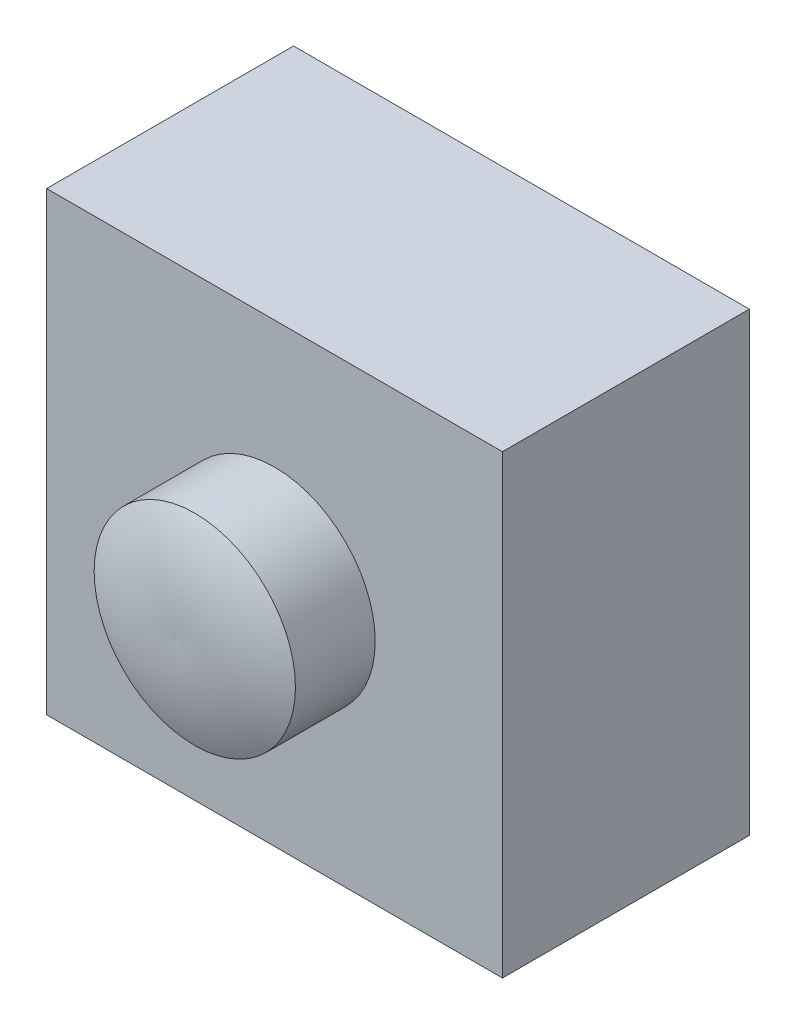
ISO-10303-21;
HEADER;
FILE_DESCRIPTION(('STEP AP214'),'2;1');
FILE_NAME('part.step','',(''),(''),'','','');
FILE_SCHEMA(('AUTOMOTIVE_DESIGN { 1 0 10303 214 1 1 1 1 }'));
ENDSEC;
DATA;
#1=APPLICATION_CONTEXT('core data for automotive mechanical design processes');
#2=APPLICATION_PROTOCOL_DEFINITION('international standard','automotive_design',2000,#1);
#3=PRODUCT_CONTEXT('',#1,'mechanical');
#4=PRODUCT('Part','Part','',(#3));
#5=PRODUCT_RELATED_PRODUCT_CATEGORY('part','',(#4));
#6=PRODUCT_DEFINITION_FORMATION('','',#4);
#7=PRODUCT_DEFINITION_CONTEXT('part definition',#1,'design');
#8=PRODUCT_DEFINITION('design','',#6,#7);
#9=PRODUCT_DEFINITION_SHAPE('','',#8);
#10=(LENGTH_UNIT() NAMED_UNIT(*) SI_UNIT(.MILLI.,.METRE.));
#11=(NAMED_UNIT(*) PLANE_ANGLE_UNIT() SI_UNIT($,.RADIAN.));
#12=(NAMED_UNIT(*) SI_UNIT($,.STERADIAN.) SOLID_ANGLE_UNIT());
#13=UNCERTAINTY_MEASURE_WITH_UNIT(LENGTH_MEASURE(1.E-05),#10,'distance_accuracy_value','');
#14=(GEOMETRIC_REPRESENTATION_CONTEXT(3) GLOBAL_UNCERTAINTY_ASSIGNED_CONTEXT((#13)) GLOBAL_UNIT_ASSIGNED_CONTEXT((#10,
#11,#12)) REPRESENTATION_CONTEXT('',''));
#15=CARTESIAN_POINT('',(0.,0.,0.));
#16=DIRECTION('',(0.,0.,1.));
#17=DIRECTION('',(1.,0.,0.));
#18=AXIS2_PLACEMENT_3D('',#15,#16,#17);
#19=CARTESIAN_POINT('',(0.,0.,6.5));
#20=DIRECTION('',(0.,1.,0.));
#21=DIRECTION('',(0.,0.,1.));
#22=AXIS2_PLACEMENT_3D('',#19,#20,#21);
#23=PLANE('',#22);
#24=DIRECTION('',(0.,0.,-1.));
#25=VECTOR('',#24,1.);
#26=CARTESIAN_POINT('',(2.55,0.,3.6));
#27=LINE('',#26,#25);
#28=CARTESIAN_POINT('',(2.55,0.,3.6));
#29=VERTEX_POINT('',#28);
#30=CARTESIAN_POINT('',(2.55,0.,3.2));
#31=VERTEX_POINT('',#30);
#32=EDGE_CURVE('E419',#29,#31,#27,.T.);
#33=ORIENTED_EDGE('',*,*,#32,.F.);
#34=DIRECTION('',(-1.,0.,0.));
#35=VECTOR('',#34,1.);
#36=CARTESIAN_POINT('',(4.15,0.,3.6));
#37=LINE('',#36,#35);
#38=CARTESIAN_POINT('',(4.15,0.,3.6));
#39=VERTEX_POINT('',#38);
#40=EDGE_CURVE('E431',#39,#29,#37,.T.);
#41=ORIENTED_EDGE('',*,*,#40,.F.);
#42=DIRECTION('',(0.,0.,1.));
#43=VECTOR('',#42,1.);
#44=CARTESIAN_POINT('',(4.15,0.,3.6));
#45=LINE('',#44,#43);
#46=CARTESIAN_POINT('',(4.15,0.,3.2));
#47=VERTEX_POINT('',#46);
#48=EDGE_CURVE('E427',#47,#39,#45,.T.);
#49=ORIENTED_EDGE('',*,*,#48,.F.);
#50=DIRECTION('',(1.,0.,0.));
#51=VECTOR('',#50,1.);
#52=CARTESIAN_POINT('',(4.15,0.,3.2));
#53=LINE('',#52,#51);
#54=EDGE_CURVE('E423',#31,#47,#53,.T.);
#55=ORIENTED_EDGE('',*,*,#54,.F.);
#56=EDGE_LOOP('',(#33,#41,#49,#55));
#57=FACE_BOUND('',#56,.T.);
#58=DIRECTION('',(1.,0.,0.));
#59=VECTOR('',#58,1.);
#60=CARTESIAN_POINT('',(0.,0.,0.));
#61=LINE('',#60,#59);
#62=CARTESIAN_POINT('',(0.,0.,0.));
#63=VERTEX_POINT('',#62);
#64=CARTESIAN_POINT('',(12.,0.,0.));
#65=VERTEX_POINT('',#64);
#66=EDGE_CURVE('E474',#63,#65,#61,.T.);
#67=ORIENTED_EDGE('',*,*,#66,.T.);
#68=DIRECTION('',(0.,0.,-1.));
#69=VECTOR('',#68,1.);
#70=CARTESIAN_POINT('',(12.,0.,6.5));
#71=LINE('',#70,#69);
#72=CARTESIAN_POINT('',(12.,0.,6.5));
#73=VERTEX_POINT('',#72);
#74=EDGE_CURVE('E489',#73,#65,#71,.T.);
#75=ORIENTED_EDGE('',*,*,#74,.F.);
#76=DIRECTION('',(1.,0.,0.));
#77=VECTOR('',#76,1.);
#78=CARTESIAN_POINT('',(0.,0.,6.5));
#79=LINE('',#78,#77);
#80=CARTESIAN_POINT('',(0.,0.,6.5));
#81=VERTEX_POINT('',#80);
#82=EDGE_CURVE('E460',#81,#73,#79,.T.);
#83=ORIENTED_EDGE('',*,*,#82,.F.);
#84=DIRECTION('',(0.,0.,-1.));
#85=VECTOR('',#84,1.);
#86=CARTESIAN_POINT('',(0.,0.,6.5));
#87=LINE('',#86,#85);
#88=EDGE_CURVE('E493',#81,#63,#87,.T.);
#89=ORIENTED_EDGE('',*,*,#88,.T.);
#90=EDGE_LOOP('',(#67,#75,#83,#89));
#91=FACE_BOUND('',#90,.T.);
#92=DIRECTION('',(0.,0.,-1.));
#93=VECTOR('',#92,1.);
#94=CARTESIAN_POINT('',(7.85,0.,3.6));
#95=LINE('',#94,#93);
#96=CARTESIAN_POINT('',(7.85,0.,3.6));
#97=VERTEX_POINT('',#96);
#98=CARTESIAN_POINT('',(7.85,0.,3.2));
#99=VERTEX_POINT('',#98);
#100=EDGE_CURVE('E391',#97,#99,#95,.T.);
#101=ORIENTED_EDGE('',*,*,#100,.F.);
#102=DIRECTION('',(-1.,0.,0.));
#103=VECTOR('',#102,1.);
#104=CARTESIAN_POINT('',(7.85,0.,3.6));
#105=LINE('',#104,#103);
#106=CARTESIAN_POINT('',(9.45,0.,3.6));
#107=VERTEX_POINT('',#106);
#108=EDGE_CURVE('E403',#107,#97,#105,.T.);
#109=ORIENTED_EDGE('',*,*,#108,.F.);
#110=DIRECTION('',(0.,0.,1.));
#111=VECTOR('',#110,1.);
#112=CARTESIAN_POINT('',(9.45,0.,3.6));
#113=LINE('',#112,#111);
#114=CARTESIAN_POINT('',(9.45,0.,3.2));
#115=VERTEX_POINT('',#114);
#116=EDGE_CURVE('E399',#115,#107,#113,.T.);
#117=ORIENTED_EDGE('',*,*,#116,.F.);
#118=DIRECTION('',(1.,0.,0.));
#119=VECTOR('',#118,1.);
#120=CARTESIAN_POINT('',(7.85,0.,3.2));
#121=LINE('',#120,#119);
#122=EDGE_CURVE('E395',#99,#115,#121,.T.);
#123=ORIENTED_EDGE('',*,*,#122,.F.);
#124=EDGE_LOOP('',(#101,#109,#117,#123));
#125=FACE_BOUND('',#124,.T.);
#126=ADVANCED_FACE('F48',(#57,#91,#125),#23,.F.);
#127=CARTESIAN_POINT('',(0.,0.,6.5));
#128=DIRECTION('',(1.,0.,0.));
#129=DIRECTION('',(0.,0.,-1.));
#130=AXIS2_PLACEMENT_3D('',#127,#128,#129);
#131=PLANE('',#130);
#132=DIRECTION('',(0.,-1.,0.));
#133=VECTOR('',#132,1.);
#134=CARTESIAN_POINT('',(0.,0.,0.));
#135=LINE('',#134,#133);
#136=CARTESIAN_POINT('',(0.,12.,0.));
#137=VERTEX_POINT('',#136);
#138=EDGE_CURVE('E455',#137,#63,#135,.T.);
#139=ORIENTED_EDGE('',*,*,#138,.T.);
#140=ORIENTED_EDGE('',*,*,#88,.F.);
#141=DIRECTION('',(0.,-1.,0.));
#142=VECTOR('',#141,1.);
#143=CARTESIAN_POINT('',(0.,0.,6.5));
#144=LINE('',#143,#142);
#145=CARTESIAN_POINT('',(0.,12.,6.5));
#146=VERTEX_POINT('',#145);
#147=EDGE_CURVE('E456',#146,#81,#144,.T.);
#148=ORIENTED_EDGE('',*,*,#147,.F.);
#149=DIRECTION('',(0.,0.,-1.));
#150=VECTOR('',#149,1.);
#151=CARTESIAN_POINT('',(0.,12.,6.5));
#152=LINE('',#151,#150);
#153=EDGE_CURVE('E470',#146,#137,#152,.T.);
#154=ORIENTED_EDGE('',*,*,#153,.T.);
#155=EDGE_LOOP('',(#139,#140,#148,#154));
#156=FACE_BOUND('',#155,.T.);
#157=ADVANCED_FACE('F678',(#156),#131,.F.);
#158=CARTESIAN_POINT('',(12.,0.,6.5));
#159=DIRECTION('',(-1.,0.,0.));
#160=DIRECTION('',(0.,0.,1.));
#161=AXIS2_PLACEMENT_3D('',#158,#159,#160);
#162=PLANE('',#161);
#163=DIRECTION('',(0.,1.,0.));
#164=VECTOR('',#163,1.);
#165=CARTESIAN_POINT('',(12.,0.,0.));
#166=LINE('',#165,#164);
#167=CARTESIAN_POINT('',(12.,12.,0.));
#168=VERTEX_POINT('',#167);
#169=EDGE_CURVE('E477',#65,#168,#166,.T.);
#170=ORIENTED_EDGE('',*,*,#169,.T.);
#171=DIRECTION('',(0.,0.,-1.));
#172=VECTOR('',#171,1.);
#173=CARTESIAN_POINT('',(12.,12.,6.5));
#174=LINE('',#173,#172);
#175=CARTESIAN_POINT('',(12.,12.,6.5));
#176=VERTEX_POINT('',#175);
#177=EDGE_CURVE('E485',#176,#168,#174,.T.);
#178=ORIENTED_EDGE('',*,*,#177,.F.);
#179=DIRECTION('',(0.,1.,0.));
#180=VECTOR('',#179,1.);
#181=CARTESIAN_POINT('',(12.,0.,6.5));
#182=LINE('',#181,#180);
#183=EDGE_CURVE('E464',#73,#176,#182,.T.);
#184=ORIENTED_EDGE('',*,*,#183,.F.);
#185=ORIENTED_EDGE('',*,*,#74,.T.);
#186=EDGE_LOOP('',(#170,#178,#184,#185));
#187=FACE_BOUND('',#186,.T.);
#188=ADVANCED_FACE('F684',(#187),#162,.F.);
#189=CARTESIAN_POINT('',(0.,12.,6.5));
#190=DIRECTION('',(0.,-1.,0.));
#191=DIRECTION('',(0.,0.,-1.));
#192=AXIS2_PLACEMENT_3D('',#189,#190,#191);
#193=PLANE('',#192);
#194=DIRECTION('',(-1.,0.,0.));
#195=VECTOR('',#194,1.);
#196=CARTESIAN_POINT('',(0.,12.,0.));
#197=LINE('',#196,#195);
#198=EDGE_CURVE('E461',#168,#137,#197,.T.);
#199=ORIENTED_EDGE('',*,*,#198,.T.);
#200=ORIENTED_EDGE('',*,*,#153,.F.);
#201=DIRECTION('',(-1.,0.,0.));
#202=VECTOR('',#201,1.);
#203=CARTESIAN_POINT('',(0.,12.,6.5));
#204=LINE('',#203,#202);
#205=EDGE_CURVE('E467',#176,#146,#204,.T.);
#206=ORIENTED_EDGE('',*,*,#205,.F.);
#207=ORIENTED_EDGE('',*,*,#177,.T.);
#208=EDGE_LOOP('',(#199,#200,#206,#207));
#209=FACE_BOUND('',#208,.T.);
#210=ADVANCED_FACE('F757',(#209),#193,.F.);
#211=CARTESIAN_POINT('',(0.,0.,6.5));
#212=DIRECTION('',(0.,0.,-1.));
#213=DIRECTION('',(-1.,0.,0.));
#214=AXIS2_PLACEMENT_3D('',#211,#212,#213);
#215=PLANE('',#214);
#216=CARTESIAN_POINT('',(6.,6.,6.5));
#217=DIRECTION('',(0.,0.,-1.));
#218=DIRECTION('',(-1.,0.,0.));
#219=AXIS2_PLACEMENT_3D('',#216,#217,#218);
#220=CIRCLE('',#219,2.65);
#221=CARTESIAN_POINT('',(3.35,6.,6.5));
#222=VERTEX_POINT('',#221);
#223=EDGE_CURVE('E451',#222,#222,#220,.T.);
#224=ORIENTED_EDGE('',*,*,#223,.T.);
#225=EDGE_LOOP('',(#224));
#226=FACE_BOUND('',#225,.T.);
#227=ORIENTED_EDGE('',*,*,#147,.T.);
#228=ORIENTED_EDGE('',*,*,#82,.T.);
#229=ORIENTED_EDGE('',*,*,#183,.T.);
#230=ORIENTED_EDGE('',*,*,#205,.T.);
#231=EDGE_LOOP('',(#227,#228,#229,#230));
#232=FACE_BOUND('',#231,.T.);
#233=ADVANCED_FACE('F754',(#226,#232),#215,.F.);
#234=CARTESIAN_POINT('',(0.,0.,0.));
#235=DIRECTION('',(0.,0.,-1.));
#236=DIRECTION('',(-1.,0.,0.));
#237=AXIS2_PLACEMENT_3D('',#234,#235,#236);
#238=PLANE('',#237);
#239=ORIENTED_EDGE('',*,*,#138,.F.);
#240=ORIENTED_EDGE('',*,*,#198,.F.);
#241=ORIENTED_EDGE('',*,*,#169,.F.);
#242=ORIENTED_EDGE('',*,*,#66,.F.);
#243=EDGE_LOOP('',(#239,#240,#241,#242));
#244=FACE_BOUND('',#243,.T.);
#245=ADVANCED_FACE('F752',(#244),#238,.T.);
#246=CARTESIAN_POINT('',(6.,6.,6.5));
#247=DIRECTION('',(0.,0.,-1.));
#248=DIRECTION('',(-1.,0.,0.));
#249=AXIS2_PLACEMENT_3D('',#246,#247,#248);
#250=CYLINDRICAL_SURFACE('',#249,2.65);
#251=CARTESIAN_POINT('',(6.,6.,8.6));
#252=DIRECTION('',(0.,0.,-1.));
#253=DIRECTION('',(-1.,0.,0.));
#254=AXIS2_PLACEMENT_3D('',#251,#252,#253);
#255=CIRCLE('',#254,2.65);
#256=CARTESIAN_POINT('',(3.35,6.,8.6));
#257=VERTEX_POINT('',#256);
#258=EDGE_CURVE('E447',#257,#257,#255,.T.);
#259=ORIENTED_EDGE('',*,*,#258,.T.);
#260=EDGE_LOOP('',(#259));
#261=FACE_BOUND('',#260,.T.);
#262=ORIENTED_EDGE('',*,*,#223,.F.);
#263=EDGE_LOOP('',(#262));
#264=FACE_BOUND('',#263,.T.);
#265=ADVANCED_FACE('F748',(#261,#264),#250,.T.);
#266=CARTESIAN_POINT('',(5.66335814684424,6.,3.61170182172552));
#267=DIRECTION('',(0.,-1.,0.));
#268=DIRECTION('',(-1.,0.,0.));
#269=AXIS2_PLACEMENT_3D('',#266,#267,#268);
#270=CIRCLE('',#269,5.49861297337312);
#271=TRIMMED_CURVE('',#270,(PARAMETER_VALUE(-1.63205768742065)),
(PARAMETER_VALUE(1.63205768742065)),.T.,.PARAMETER.);
#272=CARTESIAN_POINT('',(6.,6.,3.61170182172552));
#273=DIRECTION('',(0.,0.,-1.));
#274=AXIS1_PLACEMENT('',#272,#273);
#275=SURFACE_OF_REVOLUTION('',#271,#274);
#276=CARTESIAN_POINT('',(6.,6.,9.1));
#277=VERTEX_POINT('',#276);
#278=VERTEX_LOOP('',#277);
#279=FACE_BOUND('',#278,.T.);
#280=ORIENTED_EDGE('',*,*,#258,.F.);
#281=EDGE_LOOP('',(#280));
#282=FACE_BOUND('',#281,.T.);
#283=ADVANCED_FACE('F742',(#279,#282),#275,.T.);
#284=CARTESIAN_POINT('',(2.55,-0.5,3.6));
#285=DIRECTION('',(1.,0.,0.));
#286=DIRECTION('',(0.,0.,-1.));
#287=AXIS2_PLACEMENT_3D('',#284,#285,#286);
#288=PLANE('',#287);
#289=DIRECTION('',(0.,0.,1.));
#290=VECTOR('',#289,1.);
#291=CARTESIAN_POINT('',(2.55,-0.9,0.));
#292=LINE('',#291,#290);
#293=CARTESIAN_POINT('',(2.55,-0.9,0.4));
#294=VERTEX_POINT('',#293);
#295=CARTESIAN_POINT('',(2.55,-0.9,3.));
#296=VERTEX_POINT('',#295);
#297=EDGE_CURVE('E340',#294,#296,#292,.T.);
#298=ORIENTED_EDGE('',*,*,#297,.T.);
#299=CARTESIAN_POINT('',(2.55,-0.3,3.));
#300=DIRECTION('',(1.,0.,0.));
#301=DIRECTION('',(0.,0.,-1.));
#302=AXIS2_PLACEMENT_3D('',#299,#300,#301);
#303=CIRCLE('',#302,0.6);
#304=CARTESIAN_POINT('',(2.55,-0.3,3.6));
#305=VERTEX_POINT('',#304);
#306=EDGE_CURVE('E514',#296,#305,#303,.F.);
#307=ORIENTED_EDGE('',*,*,#306,.T.);
#308=DIRECTION('',(0.,1.,0.));
#309=VECTOR('',#308,1.);
#310=CARTESIAN_POINT('',(2.55,-0.5,3.6));
#311=LINE('',#310,#309);
#312=EDGE_CURVE('E435',#305,#29,#311,.T.);
#313=ORIENTED_EDGE('',*,*,#312,.T.);
#314=ORIENTED_EDGE('',*,*,#32,.T.);
#315=DIRECTION('',(0.,1.,0.));
#316=VECTOR('',#315,1.);
#317=CARTESIAN_POINT('',(2.55,-0.5,3.2));
#318=LINE('',#317,#316);
#319=CARTESIAN_POINT('',(2.55,-0.2,3.2));
#320=VERTEX_POINT('',#319);
#321=EDGE_CURVE('E444',#320,#31,#318,.T.);
#322=ORIENTED_EDGE('',*,*,#321,.F.);
#323=CARTESIAN_POINT('',(2.55,-0.2,2.9));
#324=DIRECTION('',(1.,0.,0.));
#325=DIRECTION('',(0.,0.,-1.));
#326=AXIS2_PLACEMENT_3D('',#323,#324,#325);
#327=CIRCLE('',#326,0.3);
#328=CARTESIAN_POINT('',(2.55,-0.5,2.9));
#329=VERTEX_POINT('',#328);
#330=EDGE_CURVE('E11',#320,#329,#327,.T.);
#331=ORIENTED_EDGE('',*,*,#330,.T.);
#332=DIRECTION('',(0.,0.,1.));
#333=VECTOR('',#332,1.);
#334=CARTESIAN_POINT('',(2.55,-0.5,0.));
#335=LINE('',#334,#333);
#336=CARTESIAN_POINT('',(2.55,-0.5,0.4));
#337=VERTEX_POINT('',#336);
#338=EDGE_CURVE('E364',#337,#329,#335,.T.);
#339=ORIENTED_EDGE('',*,*,#338,.F.);
#340=DIRECTION('',(0.,1.,0.));
#341=VECTOR('',#340,1.);
#342=CARTESIAN_POINT('',(2.55,-0.9,0.4));
#343=LINE('',#342,#341);
#344=EDGE_CURVE('E373',#294,#337,#343,.T.);
#345=ORIENTED_EDGE('',*,*,#344,.F.);
#346=EDGE_LOOP('',(#298,#307,#313,#314,#322,#331,#339,#345));
#347=FACE_BOUND('',#346,.T.);
#348=ADVANCED_FACE('F708',(#347),#288,.F.);
#349=CARTESIAN_POINT('',(4.15,-0.5,3.2));
#350=DIRECTION('',(0.,0.,1.));
#351=DIRECTION('',(1.,0.,0.));
#352=AXIS2_PLACEMENT_3D('',#349,#350,#351);
#353=PLANE('',#352);
#354=DIRECTION('',(0.,1.,0.));
#355=VECTOR('',#354,1.);
#356=CARTESIAN_POINT('',(4.15,-0.5,3.2));
#357=LINE('',#356,#355);
#358=CARTESIAN_POINT('',(4.15,-0.2,3.2));
#359=VERTEX_POINT('',#358);
#360=EDGE_CURVE('E441',#359,#47,#357,.T.);
#361=ORIENTED_EDGE('',*,*,#360,.F.);
#362=DIRECTION('',(1.,0.,0.));
#363=VECTOR('',#362,1.);
#364=CARTESIAN_POINT('',(2.55,-0.2,3.2));
#365=LINE('',#364,#363);
#366=EDGE_CURVE('E64',#359,#320,#365,.F.);
#367=ORIENTED_EDGE('',*,*,#366,.T.);
#368=ORIENTED_EDGE('',*,*,#321,.T.);
#369=ORIENTED_EDGE('',*,*,#54,.T.);
#370=EDGE_LOOP('',(#361,#367,#368,#369));
#371=FACE_BOUND('',#370,.T.);
#372=ADVANCED_FACE('F734',(#371),#353,.F.);
#373=CARTESIAN_POINT('',(4.15,-0.5,3.6));
#374=DIRECTION('',(-1.,0.,0.));
#375=DIRECTION('',(0.,0.,1.));
#376=AXIS2_PLACEMENT_3D('',#373,#374,#375);
#377=PLANE('',#376);
#378=DIRECTION('',(0.,1.,0.));
#379=VECTOR('',#378,1.);
#380=CARTESIAN_POINT('',(4.15,-0.5,3.6));
#381=LINE('',#380,#379);
#382=CARTESIAN_POINT('',(4.15,-0.3,3.6));
#383=VERTEX_POINT('',#382);
#384=EDGE_CURVE('E438',#383,#39,#381,.T.);
#385=ORIENTED_EDGE('',*,*,#384,.F.);
#386=CARTESIAN_POINT('',(4.15,-0.3,3.));
#387=DIRECTION('',(-1.,0.,0.));
#388=DIRECTION('',(0.,0.,1.));
#389=AXIS2_PLACEMENT_3D('',#386,#387,#388);
#390=CIRCLE('',#389,0.6);
#391=CARTESIAN_POINT('',(4.15,-0.9,3.));
#392=VERTEX_POINT('',#391);
#393=EDGE_CURVE('E520',#383,#392,#390,.F.);
#394=ORIENTED_EDGE('',*,*,#393,.T.);
#395=DIRECTION('',(0.,0.,1.));
#396=VECTOR('',#395,1.);
#397=CARTESIAN_POINT('',(4.15,-0.9,0.));
#398=LINE('',#397,#396);
#399=CARTESIAN_POINT('',(4.15,-0.9,0.4));
#400=VERTEX_POINT('',#399);
#401=EDGE_CURVE('E336',#400,#392,#398,.T.);
#402=ORIENTED_EDGE('',*,*,#401,.F.);
#403=DIRECTION('',(0.,1.,0.));
#404=VECTOR('',#403,1.);
#405=CARTESIAN_POINT('',(4.15,-0.9,0.4));
#406=LINE('',#405,#404);
#407=CARTESIAN_POINT('',(4.15,-0.5,0.4));
#408=VERTEX_POINT('',#407);
#409=EDGE_CURVE('E376',#400,#408,#406,.T.);
#410=ORIENTED_EDGE('',*,*,#409,.T.);
#411=DIRECTION('',(0.,0.,1.));
#412=VECTOR('',#411,1.);
#413=CARTESIAN_POINT('',(4.15,-0.5,0.));
#414=LINE('',#413,#412);
#415=CARTESIAN_POINT('',(4.15,-0.5,2.9));
#416=VERTEX_POINT('',#415);
#417=EDGE_CURVE('E361',#408,#416,#414,.T.);
#418=ORIENTED_EDGE('',*,*,#417,.T.);
#419=CARTESIAN_POINT('',(4.15,-0.2,2.9));
#420=DIRECTION('',(-1.,0.,0.));
#421=DIRECTION('',(0.,0.,1.));
#422=AXIS2_PLACEMENT_3D('',#419,#420,#421);
#423=CIRCLE('',#422,0.3);
#424=EDGE_CURVE('E57',#416,#359,#423,.T.);
#425=ORIENTED_EDGE('',*,*,#424,.T.);
#426=ORIENTED_EDGE('',*,*,#360,.T.);
#427=ORIENTED_EDGE('',*,*,#48,.T.);
#428=EDGE_LOOP('',(#385,#394,#402,#410,#418,#425,#426,#427));
#429=FACE_BOUND('',#428,.T.);
#430=ADVANCED_FACE('F733',(#429),#377,.F.);
#431=CARTESIAN_POINT('',(4.15,-0.5,3.6));
#432=DIRECTION('',(0.,0.,-1.));
#433=DIRECTION('',(-1.,0.,0.));
#434=AXIS2_PLACEMENT_3D('',#431,#432,#433);
#435=PLANE('',#434);
#436=ORIENTED_EDGE('',*,*,#312,.F.);
#437=DIRECTION('',(-1.,0.,0.));
#438=VECTOR('',#437,1.);
#439=CARTESIAN_POINT('',(4.15,-0.3,3.6));
#440=LINE('',#439,#438);
#441=EDGE_CURVE('E517',#305,#383,#440,.F.);
#442=ORIENTED_EDGE('',*,*,#441,.T.);
#443=ORIENTED_EDGE('',*,*,#384,.T.);
#444=ORIENTED_EDGE('',*,*,#40,.T.);
#445=EDGE_LOOP('',(#436,#442,#443,#444));
#446=FACE_BOUND('',#445,.T.);
#447=ADVANCED_FACE('F728',(#446),#435,.F.);
#448=CARTESIAN_POINT('',(7.85,-0.5,3.6));
#449=DIRECTION('',(1.,0.,0.));
#450=DIRECTION('',(0.,0.,-1.));
#451=AXIS2_PLACEMENT_3D('',#448,#449,#450);
#452=PLANE('',#451);
#453=DIRECTION('',(0.,0.,1.));
#454=VECTOR('',#453,1.);
#455=CARTESIAN_POINT('',(7.85,-0.9,0.));
#456=LINE('',#455,#454);
#457=CARTESIAN_POINT('',(7.85,-0.9,0.4));
#458=VERTEX_POINT('',#457);
#459=CARTESIAN_POINT('',(7.85,-0.9,3.));
#460=VERTEX_POINT('',#459);
#461=EDGE_CURVE('E279',#458,#460,#456,.T.);
#462=ORIENTED_EDGE('',*,*,#461,.T.);
#463=CARTESIAN_POINT('',(7.85,-0.3,3.));
#464=DIRECTION('',(1.,0.,0.));
#465=DIRECTION('',(0.,0.,-1.));
#466=AXIS2_PLACEMENT_3D('',#463,#464,#465);
#467=CIRCLE('',#466,0.6);
#468=CARTESIAN_POINT('',(7.85,-0.3,3.6));
#469=VERTEX_POINT('',#468);
#470=EDGE_CURVE('E501',#460,#469,#467,.F.);
#471=ORIENTED_EDGE('',*,*,#470,.T.);
#472=DIRECTION('',(0.,1.,0.));
#473=VECTOR('',#472,1.);
#474=CARTESIAN_POINT('',(7.85,-0.5,3.6));
#475=LINE('',#474,#473);
#476=EDGE_CURVE('E407',#469,#97,#475,.T.);
#477=ORIENTED_EDGE('',*,*,#476,.T.);
#478=ORIENTED_EDGE('',*,*,#100,.T.);
#479=DIRECTION('',(0.,1.,0.));
#480=VECTOR('',#479,1.);
#481=CARTESIAN_POINT('',(7.85,-0.5,3.2));
#482=LINE('',#481,#480);
#483=CARTESIAN_POINT('',(7.85,-0.2,3.2));
#484=VERTEX_POINT('',#483);
#485=EDGE_CURVE('E416',#484,#99,#482,.T.);
#486=ORIENTED_EDGE('',*,*,#485,.F.);
#487=CARTESIAN_POINT('',(7.85,-0.2,2.9));
#488=DIRECTION('',(1.,0.,0.));
#489=DIRECTION('',(0.,0.,-1.));
#490=AXIS2_PLACEMENT_3D('',#487,#488,#489);
#491=CIRCLE('',#490,0.3);
#492=CARTESIAN_POINT('',(7.85,-0.5,2.9));
#493=VERTEX_POINT('',#492);
#494=EDGE_CURVE('E539',#484,#493,#491,.T.);
#495=ORIENTED_EDGE('',*,*,#494,.T.);
#496=DIRECTION('',(0.,0.,1.));
#497=VECTOR('',#496,1.);
#498=CARTESIAN_POINT('',(7.85,-0.5,0.));
#499=LINE('',#498,#497);
#500=CARTESIAN_POINT('',(7.85,-0.5,0.4));
#501=VERTEX_POINT('',#500);
#502=EDGE_CURVE('E301',#501,#493,#499,.T.);
#503=ORIENTED_EDGE('',*,*,#502,.F.);
#504=DIRECTION('',(0.,1.,0.));
#505=VECTOR('',#504,1.);
#506=CARTESIAN_POINT('',(7.85,-0.9,0.4));
#507=LINE('',#506,#505);
#508=EDGE_CURVE('E313',#458,#501,#507,.T.);
#509=ORIENTED_EDGE('',*,*,#508,.F.);
#510=EDGE_LOOP('',(#462,#471,#477,#478,#486,#495,#503,#509));
#511=FACE_BOUND('',#510,.T.);
#512=ADVANCED_FACE('F630',(#511),#452,.F.);
#513=CARTESIAN_POINT('',(7.85,-0.5,3.2));
#514=DIRECTION('',(0.,0.,1.));
#515=DIRECTION('',(1.,0.,0.));
#516=AXIS2_PLACEMENT_3D('',#513,#514,#515);
#517=PLANE('',#516);
#518=DIRECTION('',(0.,1.,0.));
#519=VECTOR('',#518,1.);
#520=CARTESIAN_POINT('',(9.45,-0.5,3.2));
#521=LINE('',#520,#519);
#522=CARTESIAN_POINT('',(9.45,-0.2,3.2));
#523=VERTEX_POINT('',#522);
#524=EDGE_CURVE('E413',#523,#115,#521,.T.);
#525=ORIENTED_EDGE('',*,*,#524,.F.);
#526=DIRECTION('',(1.,0.,0.));
#527=VECTOR('',#526,1.);
#528=CARTESIAN_POINT('',(7.85,-0.2,3.2));
#529=LINE('',#528,#527);
#530=EDGE_CURVE('E527',#523,#484,#529,.F.);
#531=ORIENTED_EDGE('',*,*,#530,.T.);
#532=ORIENTED_EDGE('',*,*,#485,.T.);
#533=ORIENTED_EDGE('',*,*,#122,.T.);
#534=EDGE_LOOP('',(#525,#531,#532,#533));
#535=FACE_BOUND('',#534,.T.);
#536=ADVANCED_FACE('F645',(#535),#517,.F.);
#537=CARTESIAN_POINT('',(9.45,-0.5,3.6));
#538=DIRECTION('',(-1.,0.,0.));
#539=DIRECTION('',(0.,0.,1.));
#540=AXIS2_PLACEMENT_3D('',#537,#538,#539);
#541=PLANE('',#540);
#542=DIRECTION('',(0.,1.,0.));
#543=VECTOR('',#542,1.);
#544=CARTESIAN_POINT('',(9.45,-0.5,3.6));
#545=LINE('',#544,#543);
#546=CARTESIAN_POINT('',(9.45,-0.3,3.6));
#547=VERTEX_POINT('',#546);
#548=EDGE_CURVE('E410',#547,#107,#545,.T.);
#549=ORIENTED_EDGE('',*,*,#548,.F.);
#550=CARTESIAN_POINT('',(9.45,-0.3,3.));
#551=DIRECTION('',(-1.,0.,0.));
#552=DIRECTION('',(0.,0.,1.));
#553=AXIS2_PLACEMENT_3D('',#550,#551,#552);
#554=CIRCLE('',#553,0.6);
#555=CARTESIAN_POINT('',(9.45,-0.9,3.));
#556=VERTEX_POINT('',#555);
#557=EDGE_CURVE('E507',#547,#556,#554,.F.);
#558=ORIENTED_EDGE('',*,*,#557,.T.);
#559=DIRECTION('',(0.,0.,1.));
#560=VECTOR('',#559,1.);
#561=CARTESIAN_POINT('',(9.45,-0.9,0.));
#562=LINE('',#561,#560);
#563=CARTESIAN_POINT('',(9.45,-0.9,0.4));
#564=VERTEX_POINT('',#563);
#565=EDGE_CURVE('E276',#564,#556,#562,.T.);
#566=ORIENTED_EDGE('',*,*,#565,.F.);
#567=DIRECTION('',(0.,1.,0.));
#568=VECTOR('',#567,1.);
#569=CARTESIAN_POINT('',(9.45,-0.9,0.4));
#570=LINE('',#569,#568);
#571=CARTESIAN_POINT('',(9.45,-0.5,0.4));
#572=VERTEX_POINT('',#571);
#573=EDGE_CURVE('E316',#564,#572,#570,.T.);
#574=ORIENTED_EDGE('',*,*,#573,.T.);
#575=DIRECTION('',(0.,0.,1.));
#576=VECTOR('',#575,1.);
#577=CARTESIAN_POINT('',(9.45,-0.5,0.));
#578=LINE('',#577,#576);
#579=CARTESIAN_POINT('',(9.45,-0.5,2.9));
#580=VERTEX_POINT('',#579);
#581=EDGE_CURVE('E297',#572,#580,#578,.T.);
#582=ORIENTED_EDGE('',*,*,#581,.T.);
#583=CARTESIAN_POINT('',(9.45,-0.2,2.9));
#584=DIRECTION('',(-1.,0.,0.));
#585=DIRECTION('',(0.,0.,1.));
#586=AXIS2_PLACEMENT_3D('',#583,#584,#585);
#587=CIRCLE('',#586,0.3);
#588=EDGE_CURVE('E536',#580,#523,#587,.T.);
#589=ORIENTED_EDGE('',*,*,#588,.T.);
#590=ORIENTED_EDGE('',*,*,#524,.T.);
#591=ORIENTED_EDGE('',*,*,#116,.T.);
#592=EDGE_LOOP('',(#549,#558,#566,#574,#582,#589,#590,#591));
#593=FACE_BOUND('',#592,.T.);
#594=ADVANCED_FACE('F642',(#593),#541,.F.);
#595=CARTESIAN_POINT('',(7.85,-0.5,3.6));
#596=DIRECTION('',(0.,0.,-1.));
#597=DIRECTION('',(-1.,0.,0.));
#598=AXIS2_PLACEMENT_3D('',#595,#596,#597);
#599=PLANE('',#598);
#600=ORIENTED_EDGE('',*,*,#476,.F.);
#601=DIRECTION('',(-1.,0.,0.));
#602=VECTOR('',#601,1.);
#603=CARTESIAN_POINT('',(9.45,-0.3,3.6));
#604=LINE('',#603,#602);
#605=EDGE_CURVE('E504',#469,#547,#604,.F.);
#606=ORIENTED_EDGE('',*,*,#605,.T.);
#607=ORIENTED_EDGE('',*,*,#548,.T.);
#608=ORIENTED_EDGE('',*,*,#108,.T.);
#609=EDGE_LOOP('',(#600,#606,#607,#608));
#610=FACE_BOUND('',#609,.T.);
#611=ADVANCED_FACE('F653',(#610),#599,.F.);
#612=CARTESIAN_POINT('',(0.,-0.5,0.));
#613=DIRECTION('',(0.,-1.,0.));
#614=DIRECTION('',(0.,0.,-1.));
#615=AXIS2_PLACEMENT_3D('',#612,#613,#614);
#616=PLANE('',#615);
#617=ORIENTED_EDGE('',*,*,#338,.T.);
#618=DIRECTION('',(1.,0.,0.));
#619=VECTOR('',#618,1.);
#620=CARTESIAN_POINT('',(4.15,-0.5,2.9));
#621=LINE('',#620,#619);
#622=EDGE_CURVE('E530',#329,#416,#621,.T.);
#623=ORIENTED_EDGE('',*,*,#622,.T.);
#624=ORIENTED_EDGE('',*,*,#417,.F.);
#625=DIRECTION('',(0.707106781186547,0.,0.707106781186548));
#626=VECTOR('',#625,1.);
#627=CARTESIAN_POINT('',(1.875,-0.5,-1.875));
#628=LINE('',#627,#626);
#629=CARTESIAN_POINT('',(3.75,-0.5,0.));
#630=VERTEX_POINT('',#629);
#631=EDGE_CURVE('E358',#630,#408,#628,.T.);
#632=ORIENTED_EDGE('',*,*,#631,.F.);
#633=DIRECTION('',(0.,0.,1.));
#634=VECTOR('',#633,1.);
#635=CARTESIAN_POINT('',(3.75,-0.5,0.));
#636=LINE('',#635,#634);
#637=CARTESIAN_POINT('',(3.75,-0.5,-1.9));
#638=VERTEX_POINT('',#637);
#639=EDGE_CURVE('E355',#638,#630,#636,.T.);
#640=ORIENTED_EDGE('',*,*,#639,.F.);
#641=CARTESIAN_POINT('',(3.35,-0.5,-1.78333333333333));
#642=DIRECTION('',(0.,-1.,0.));
#643=DIRECTION('',(0.,0.,-1.));
#644=AXIS2_PLACEMENT_3D('',#641,#642,#643);
#645=CIRCLE('',#644,0.416666666666667);
#646=CARTESIAN_POINT('',(2.95,-0.5,-1.9));
#647=VERTEX_POINT('',#646);
#648=EDGE_CURVE('E352',#647,#638,#645,.T.);
#649=ORIENTED_EDGE('',*,*,#648,.F.);
#650=DIRECTION('',(0.,0.,1.));
#651=VECTOR('',#650,1.);
#652=CARTESIAN_POINT('',(2.95,-0.5,0.));
#653=LINE('',#652,#651);
#654=CARTESIAN_POINT('',(2.95,-0.5,0.));
#655=VERTEX_POINT('',#654);
#656=EDGE_CURVE('E246',#647,#655,#653,.T.);
#657=ORIENTED_EDGE('',*,*,#656,.T.);
#658=DIRECTION('',(-0.707106781186547,0.,0.707106781186548));
#659=VECTOR('',#658,1.);
#660=CARTESIAN_POINT('',(1.475,-0.5,1.475));
#661=LINE('',#660,#659);
#662=EDGE_CURVE('E327',#655,#337,#661,.T.);
#663=ORIENTED_EDGE('',*,*,#662,.T.);
#664=EDGE_LOOP('',(#617,#623,#624,#632,#640,#649,#657,#663));
#665=FACE_BOUND('',#664,.T.);
#666=ADVANCED_FACE('F710',(#665),#616,.F.);
#667=CARTESIAN_POINT('',(2.95,-0.9,0.));
#668=DIRECTION('',(-1.,0.,0.));
#669=DIRECTION('',(0.,0.,1.));
#670=AXIS2_PLACEMENT_3D('',#667,#668,#669);
#671=PLANE('',#670);
#672=ORIENTED_EDGE('',*,*,#656,.F.);
#673=DIRECTION('',(0.,1.,0.));
#674=VECTOR('',#673,1.);
#675=CARTESIAN_POINT('',(2.95,-0.9,-1.9));
#676=LINE('',#675,#674);
#677=CARTESIAN_POINT('',(2.95,-0.9,-1.9));
#678=VERTEX_POINT('',#677);
#679=EDGE_CURVE('E388',#678,#647,#676,.T.);
#680=ORIENTED_EDGE('',*,*,#679,.F.);
#681=DIRECTION('',(0.,0.,1.));
#682=VECTOR('',#681,1.);
#683=CARTESIAN_POINT('',(2.95,-0.9,0.));
#684=LINE('',#683,#682);
#685=CARTESIAN_POINT('',(2.95,-0.9,0.));
#686=VERTEX_POINT('',#685);
#687=EDGE_CURVE('E322',#678,#686,#684,.T.);
#688=ORIENTED_EDGE('',*,*,#687,.T.);
#689=DIRECTION('',(0.,1.,0.));
#690=VECTOR('',#689,1.);
#691=CARTESIAN_POINT('',(2.95,-0.9,0.));
#692=LINE('',#691,#690);
#693=EDGE_CURVE('E348',#686,#655,#692,.T.);
#694=ORIENTED_EDGE('',*,*,#693,.T.);
#695=EDGE_LOOP('',(#672,#680,#688,#694));
#696=FACE_BOUND('',#695,.T.);
#697=ADVANCED_FACE('F906',(#696),#671,.T.);
#698=CARTESIAN_POINT('',(3.35,-0.9,-1.78333333333333));
#699=DIRECTION('',(0.,1.,0.));
#700=DIRECTION('',(0.,0.,1.));
#701=AXIS2_PLACEMENT_3D('',#698,#699,#700);
#702=CYLINDRICAL_SURFACE('',#701,0.416666666666667);
#703=ORIENTED_EDGE('',*,*,#648,.T.);
#704=DIRECTION('',(0.,1.,0.));
#705=VECTOR('',#704,1.);
#706=CARTESIAN_POINT('',(3.75,-0.9,-1.9));
#707=LINE('',#706,#705);
#708=CARTESIAN_POINT('',(3.75,-0.9,-1.9));
#709=VERTEX_POINT('',#708);
#710=EDGE_CURVE('E384',#709,#638,#707,.T.);
#711=ORIENTED_EDGE('',*,*,#710,.F.);
#712=CARTESIAN_POINT('',(3.35,-0.9,-1.78333333333333));
#713=DIRECTION('',(0.,-1.,0.));
#714=DIRECTION('',(0.,0.,-1.));
#715=AXIS2_PLACEMENT_3D('',#712,#713,#714);
#716=CIRCLE('',#715,0.416666666666667);
#717=EDGE_CURVE('E326',#678,#709,#716,.T.);
#718=ORIENTED_EDGE('',*,*,#717,.F.);
#719=ORIENTED_EDGE('',*,*,#679,.T.);
#720=EDGE_LOOP('',(#703,#711,#718,#719));
#721=FACE_BOUND('',#720,.T.);
#722=ADVANCED_FACE('F919',(#721),#702,.T.);
#723=CARTESIAN_POINT('',(3.75,-0.9,0.));
#724=DIRECTION('',(-1.,0.,0.));
#725=DIRECTION('',(0.,0.,1.));
#726=AXIS2_PLACEMENT_3D('',#723,#724,#725);
#727=PLANE('',#726);
#728=ORIENTED_EDGE('',*,*,#639,.T.);
#729=DIRECTION('',(0.,1.,0.));
#730=VECTOR('',#729,1.);
#731=CARTESIAN_POINT('',(3.75,-0.9,0.));
#732=LINE('',#731,#730);
#733=CARTESIAN_POINT('',(3.75,-0.9,0.));
#734=VERTEX_POINT('',#733);
#735=EDGE_CURVE('E380',#734,#630,#732,.T.);
#736=ORIENTED_EDGE('',*,*,#735,.F.);
#737=DIRECTION('',(0.,0.,1.));
#738=VECTOR('',#737,1.);
#739=CARTESIAN_POINT('',(3.75,-0.9,0.));
#740=LINE('',#739,#738);
#741=EDGE_CURVE('E330',#709,#734,#740,.T.);
#742=ORIENTED_EDGE('',*,*,#741,.F.);
#743=ORIENTED_EDGE('',*,*,#710,.T.);
#744=EDGE_LOOP('',(#728,#736,#742,#743));
#745=FACE_BOUND('',#744,.T.);
#746=ADVANCED_FACE('F929',(#745),#727,.F.);
#747=CARTESIAN_POINT('',(1.875,-0.9,-1.875));
#748=DIRECTION('',(-0.707106781186548,0.,0.707106781186547));
#749=DIRECTION('',(0.707106781186547,0.,0.707106781186548));
#750=AXIS2_PLACEMENT_3D('',#747,#748,#749);
#751=PLANE('',#750);
#752=ORIENTED_EDGE('',*,*,#631,.T.);
#753=ORIENTED_EDGE('',*,*,#409,.F.);
#754=DIRECTION('',(0.707106781186547,0.,0.707106781186548));
#755=VECTOR('',#754,1.);
#756=CARTESIAN_POINT('',(1.875,-0.9,-1.875));
#757=LINE('',#756,#755);
#758=EDGE_CURVE('E333',#734,#400,#757,.T.);
#759=ORIENTED_EDGE('',*,*,#758,.F.);
#760=ORIENTED_EDGE('',*,*,#735,.T.);
#761=EDGE_LOOP('',(#752,#753,#759,#760));
#762=FACE_BOUND('',#761,.T.);
#763=ADVANCED_FACE('F939',(#762),#751,.F.);
#764=CARTESIAN_POINT('',(1.475,-0.9,1.475));
#765=DIRECTION('',(-0.707106781186548,0.,-0.707106781186547));
#766=DIRECTION('',(-0.707106781186547,0.,0.707106781186548));
#767=AXIS2_PLACEMENT_3D('',#764,#765,#766);
#768=PLANE('',#767);
#769=ORIENTED_EDGE('',*,*,#662,.F.);
#770=ORIENTED_EDGE('',*,*,#693,.F.);
#771=DIRECTION('',(-0.707106781186547,0.,0.707106781186548));
#772=VECTOR('',#771,1.);
#773=CARTESIAN_POINT('',(1.475,-0.9,1.475));
#774=LINE('',#773,#772);
#775=EDGE_CURVE('E344',#686,#294,#774,.T.);
#776=ORIENTED_EDGE('',*,*,#775,.T.);
#777=ORIENTED_EDGE('',*,*,#344,.T.);
#778=EDGE_LOOP('',(#769,#770,#776,#777));
#779=FACE_BOUND('',#778,.T.);
#780=ADVANCED_FACE('F716',(#779),#768,.T.);
#781=CARTESIAN_POINT('',(0.,-0.9,0.));
#782=DIRECTION('',(0.,-1.,0.));
#783=DIRECTION('',(0.,0.,-1.));
#784=AXIS2_PLACEMENT_3D('',#781,#782,#783);
#785=PLANE('',#784);
#786=ORIENTED_EDGE('',*,*,#401,.T.);
#787=DIRECTION('',(-1.,0.,0.));
#788=VECTOR('',#787,1.);
#789=CARTESIAN_POINT('',(2.55,-0.9,3.));
#790=LINE('',#789,#788);
#791=EDGE_CURVE('E510',#392,#296,#790,.T.);
#792=ORIENTED_EDGE('',*,*,#791,.T.);
#793=ORIENTED_EDGE('',*,*,#297,.F.);
#794=ORIENTED_EDGE('',*,*,#775,.F.);
#795=ORIENTED_EDGE('',*,*,#687,.F.);
#796=ORIENTED_EDGE('',*,*,#717,.T.);
#797=ORIENTED_EDGE('',*,*,#741,.T.);
#798=ORIENTED_EDGE('',*,*,#758,.T.);
#799=EDGE_LOOP('',(#786,#792,#793,#794,#795,#796,#797,#798));
#800=FACE_BOUND('',#799,.T.);
#801=ADVANCED_FACE('F720',(#800),#785,.T.);
#802=CARTESIAN_POINT('',(0.,-0.5,0.));
#803=DIRECTION('',(0.,-1.,0.));
#804=DIRECTION('',(0.,0.,-1.));
#805=AXIS2_PLACEMENT_3D('',#802,#803,#804);
#806=PLANE('',#805);
#807=ORIENTED_EDGE('',*,*,#502,.T.);
#808=DIRECTION('',(1.,0.,0.));
#809=VECTOR('',#808,1.);
#810=CARTESIAN_POINT('',(9.45,-0.5,2.9));
#811=LINE('',#810,#809);
#812=EDGE_CURVE('E523',#493,#580,#811,.T.);
#813=ORIENTED_EDGE('',*,*,#812,.T.);
#814=ORIENTED_EDGE('',*,*,#581,.F.);
#815=DIRECTION('',(0.707106781186548,0.,0.707106781186547));
#816=VECTOR('',#815,1.);
#817=CARTESIAN_POINT('',(4.52499999999999,-0.5,-4.525));
#818=LINE('',#817,#816);
#819=CARTESIAN_POINT('',(9.05,-0.5,0.));
#820=VERTEX_POINT('',#819);
#821=EDGE_CURVE('E294',#820,#572,#818,.T.);
#822=ORIENTED_EDGE('',*,*,#821,.F.);
#823=DIRECTION('',(0.,0.,1.));
#824=VECTOR('',#823,1.);
#825=CARTESIAN_POINT('',(9.05,-0.5,0.));
#826=LINE('',#825,#824);
#827=CARTESIAN_POINT('',(9.05,-0.5,-1.9));
#828=VERTEX_POINT('',#827);
#829=EDGE_CURVE('E291',#828,#820,#826,.T.);
#830=ORIENTED_EDGE('',*,*,#829,.F.);
#831=CARTESIAN_POINT('',(8.65,-0.5,-1.78333333333333));
#832=DIRECTION('',(0.,-1.,0.));
#833=DIRECTION('',(0.,0.,-1.));
#834=AXIS2_PLACEMENT_3D('',#831,#832,#833);
#835=CIRCLE('',#834,0.416666666666667);
#836=CARTESIAN_POINT('',(8.25,-0.5,-1.9));
#837=VERTEX_POINT('',#836);
#838=EDGE_CURVE('E242',#828,#837,#835,.F.);
#839=ORIENTED_EDGE('',*,*,#838,.T.);
#840=DIRECTION('',(0.,0.,1.));
#841=VECTOR('',#840,1.);
#842=CARTESIAN_POINT('',(8.25,-0.5,0.));
#843=LINE('',#842,#841);
#844=CARTESIAN_POINT('',(8.25,-0.5,0.));
#845=VERTEX_POINT('',#844);
#846=EDGE_CURVE('E264',#837,#845,#843,.T.);
#847=ORIENTED_EDGE('',*,*,#846,.T.);
#848=DIRECTION('',(-0.707106781186548,0.,0.707106781186547));
#849=VECTOR('',#848,1.);
#850=CARTESIAN_POINT('',(4.12499999999999,-0.5,4.125));
#851=LINE('',#850,#849);
#852=EDGE_CURVE('E271',#845,#501,#851,.T.);
#853=ORIENTED_EDGE('',*,*,#852,.T.);
#854=EDGE_LOOP('',(#807,#813,#814,#822,#830,#839,#847,#853));
#855=FACE_BOUND('',#854,.T.);
#856=ADVANCED_FACE('F635',(#855),#806,.F.);
#857=CARTESIAN_POINT('',(8.65,-0.9,-1.78333333333333));
#858=DIRECTION('',(0.,1.,0.));
#859=DIRECTION('',(0.,0.,1.));
#860=AXIS2_PLACEMENT_3D('',#857,#858,#859);
#861=CYLINDRICAL_SURFACE('',#860,0.416666666666667);
#862=ORIENTED_EDGE('',*,*,#838,.F.);
#863=DIRECTION('',(0.,1.,0.));
#864=VECTOR('',#863,1.);
#865=CARTESIAN_POINT('',(9.05,-0.9,-1.9));
#866=LINE('',#865,#864);
#867=CARTESIAN_POINT('',(9.05,-0.9,-1.9));
#868=VERTEX_POINT('',#867);
#869=EDGE_CURVE('E235',#868,#828,#866,.T.);
#870=ORIENTED_EDGE('',*,*,#869,.F.);
#871=CARTESIAN_POINT('',(8.65,-0.9,-1.78333333333333));
#872=DIRECTION('',(0.,-1.,0.));
#873=DIRECTION('',(0.,0.,-1.));
#874=AXIS2_PLACEMENT_3D('',#871,#872,#873);
#875=CIRCLE('',#874,0.416666666666667);
#876=CARTESIAN_POINT('',(8.25,-0.9,-1.9));
#877=VERTEX_POINT('',#876);
#878=EDGE_CURVE('E239',#868,#877,#875,.F.);
#879=ORIENTED_EDGE('',*,*,#878,.T.);
#880=DIRECTION('',(0.,1.,0.));
#881=VECTOR('',#880,1.);
#882=CARTESIAN_POINT('',(8.25,-0.9,-1.9));
#883=LINE('',#882,#881);
#884=EDGE_CURVE('E288',#877,#837,#883,.T.);
#885=ORIENTED_EDGE('',*,*,#884,.T.);
#886=EDGE_LOOP('',(#862,#870,#879,#885));
#887=FACE_BOUND('',#886,.T.);
#888=ADVANCED_FACE('F237',(#887),#861,.T.);
#889=CARTESIAN_POINT('',(9.05,-0.9,0.));
#890=DIRECTION('',(-1.,0.,0.));
#891=DIRECTION('',(0.,0.,1.));
#892=AXIS2_PLACEMENT_3D('',#889,#890,#891);
#893=PLANE('',#892);
#894=ORIENTED_EDGE('',*,*,#829,.T.);
#895=DIRECTION('',(0.,1.,0.));
#896=VECTOR('',#895,1.);
#897=CARTESIAN_POINT('',(9.05,-0.9,0.));
#898=LINE('',#897,#896);
#899=CARTESIAN_POINT('',(9.05,-0.9,0.));
#900=VERTEX_POINT('',#899);
#901=EDGE_CURVE('E247',#900,#820,#898,.T.);
#902=ORIENTED_EDGE('',*,*,#901,.F.);
#903=DIRECTION('',(0.,0.,1.));
#904=VECTOR('',#903,1.);
#905=CARTESIAN_POINT('',(9.05,-0.9,0.));
#906=LINE('',#905,#904);
#907=EDGE_CURVE('E250',#868,#900,#906,.T.);
#908=ORIENTED_EDGE('',*,*,#907,.F.);
#909=ORIENTED_EDGE('',*,*,#869,.T.);
#910=EDGE_LOOP('',(#894,#902,#908,#909));
#911=FACE_BOUND('',#910,.T.);
#912=ADVANCED_FACE('F251',(#911),#893,.F.);
#913=CARTESIAN_POINT('',(4.52499999999999,-0.9,-4.525));
#914=DIRECTION('',(-0.707106781186547,0.,0.707106781186548));
#915=DIRECTION('',(0.707106781186548,0.,0.707106781186547));
#916=AXIS2_PLACEMENT_3D('',#913,#914,#915);
#917=PLANE('',#916);
#918=ORIENTED_EDGE('',*,*,#821,.T.);
#919=ORIENTED_EDGE('',*,*,#573,.F.);
#920=DIRECTION('',(0.707106781186548,0.,0.707106781186547));
#921=VECTOR('',#920,1.);
#922=CARTESIAN_POINT('',(4.52499999999999,-0.9,-4.525));
#923=LINE('',#922,#921);
#924=EDGE_CURVE('E256',#900,#564,#923,.T.);
#925=ORIENTED_EDGE('',*,*,#924,.F.);
#926=ORIENTED_EDGE('',*,*,#901,.T.);
#927=EDGE_LOOP('',(#918,#919,#925,#926));
#928=FACE_BOUND('',#927,.T.);
#929=ADVANCED_FACE('F662',(#928),#917,.F.);
#930=CARTESIAN_POINT('',(4.12499999999999,-0.9,4.125));
#931=DIRECTION('',(-0.707106781186547,0.,-0.707106781186548));
#932=DIRECTION('',(-0.707106781186548,0.,0.707106781186547));
#933=AXIS2_PLACEMENT_3D('',#930,#931,#932);
#934=PLANE('',#933);
#935=ORIENTED_EDGE('',*,*,#852,.F.);
#936=DIRECTION('',(0.,1.,0.));
#937=VECTOR('',#936,1.);
#938=CARTESIAN_POINT('',(8.25,-0.9,0.));
#939=LINE('',#938,#937);
#940=CARTESIAN_POINT('',(8.25,-0.9,0.));
#941=VERTEX_POINT('',#940);
#942=EDGE_CURVE('E310',#941,#845,#939,.T.);
#943=ORIENTED_EDGE('',*,*,#942,.F.);
#944=DIRECTION('',(-0.707106781186548,0.,0.707106781186547));
#945=VECTOR('',#944,1.);
#946=CARTESIAN_POINT('',(4.12499999999999,-0.9,4.125));
#947=LINE('',#946,#945);
#948=EDGE_CURVE('E283',#941,#458,#947,.T.);
#949=ORIENTED_EDGE('',*,*,#948,.T.);
#950=ORIENTED_EDGE('',*,*,#508,.T.);
#951=EDGE_LOOP('',(#935,#943,#949,#950));
#952=FACE_BOUND('',#951,.T.);
#953=ADVANCED_FACE('F668',(#952),#934,.T.);
#954=CARTESIAN_POINT('',(8.25,-0.9,0.));
#955=DIRECTION('',(-1.,0.,0.));
#956=DIRECTION('',(0.,0.,1.));
#957=AXIS2_PLACEMENT_3D('',#954,#955,#956);
#958=PLANE('',#957);
#959=ORIENTED_EDGE('',*,*,#846,.F.);
#960=ORIENTED_EDGE('',*,*,#884,.F.);
#961=DIRECTION('',(0.,0.,1.));
#962=VECTOR('',#961,1.);
#963=CARTESIAN_POINT('',(8.25,-0.9,0.));
#964=LINE('',#963,#962);
#965=EDGE_CURVE('E262',#877,#941,#964,.T.);
#966=ORIENTED_EDGE('',*,*,#965,.T.);
#967=ORIENTED_EDGE('',*,*,#942,.T.);
#968=EDGE_LOOP('',(#959,#960,#966,#967));
#969=FACE_BOUND('',#968,.T.);
#970=ADVANCED_FACE('F666',(#969),#958,.T.);
#971=CARTESIAN_POINT('',(0.,-0.9,0.));
#972=DIRECTION('',(0.,-1.,0.));
#973=DIRECTION('',(0.,0.,-1.));
#974=AXIS2_PLACEMENT_3D('',#971,#972,#973);
#975=PLANE('',#974);
#976=ORIENTED_EDGE('',*,*,#565,.T.);
#977=DIRECTION('',(-1.,0.,0.));
#978=VECTOR('',#977,1.);
#979=CARTESIAN_POINT('',(7.85,-0.9,3.));
#980=LINE('',#979,#978);
#981=EDGE_CURVE('E497',#556,#460,#980,.T.);
#982=ORIENTED_EDGE('',*,*,#981,.T.);
#983=ORIENTED_EDGE('',*,*,#461,.F.);
#984=ORIENTED_EDGE('',*,*,#948,.F.);
#985=ORIENTED_EDGE('',*,*,#965,.F.);
#986=ORIENTED_EDGE('',*,*,#878,.F.);
#987=ORIENTED_EDGE('',*,*,#907,.T.);
#988=ORIENTED_EDGE('',*,*,#924,.T.);
#989=EDGE_LOOP('',(#976,#982,#983,#984,#985,#986,#987,#988));
#990=FACE_BOUND('',#989,.T.);
#991=ADVANCED_FACE('F259',(#990),#975,.T.);
#992=CARTESIAN_POINT('',(0.,-0.3,3.));
#993=DIRECTION('',(1.,0.,0.));
#994=DIRECTION('',(0.,0.,-1.));
#995=AXIS2_PLACEMENT_3D('',#992,#993,#994);
#996=CYLINDRICAL_SURFACE('',#995,0.6);
#997=ORIENTED_EDGE('',*,*,#557,.F.);
#998=ORIENTED_EDGE('',*,*,#605,.F.);
#999=ORIENTED_EDGE('',*,*,#470,.F.);
#1000=ORIENTED_EDGE('',*,*,#981,.F.);
#1001=EDGE_LOOP('',(#997,#998,#999,#1000));
#1002=FACE_BOUND('',#1001,.T.);
#1003=ADVANCED_FACE('F656',(#1002),#996,.T.);
#1004=CARTESIAN_POINT('',(0.,-0.3,3.));
#1005=DIRECTION('',(1.,0.,0.));
#1006=DIRECTION('',(0.,0.,-1.));
#1007=AXIS2_PLACEMENT_3D('',#1004,#1005,#1006);
#1008=CYLINDRICAL_SURFACE('',#1007,0.6);
#1009=ORIENTED_EDGE('',*,*,#393,.F.);
#1010=ORIENTED_EDGE('',*,*,#441,.F.);
#1011=ORIENTED_EDGE('',*,*,#306,.F.);
#1012=ORIENTED_EDGE('',*,*,#791,.F.);
#1013=EDGE_LOOP('',(#1009,#1010,#1011,#1012));
#1014=FACE_BOUND('',#1013,.T.);
#1015=ADVANCED_FACE('F694',(#1014),#1008,.T.);
#1016=CARTESIAN_POINT('',(0.,-0.2,2.9));
#1017=DIRECTION('',(-1.,0.,0.));
#1018=DIRECTION('',(0.,0.,1.));
#1019=AXIS2_PLACEMENT_3D('',#1016,#1017,#1018);
#1020=CYLINDRICAL_SURFACE('',#1019,0.3);
#1021=ORIENTED_EDGE('',*,*,#494,.F.);
#1022=ORIENTED_EDGE('',*,*,#530,.F.);
#1023=ORIENTED_EDGE('',*,*,#588,.F.);
#1024=ORIENTED_EDGE('',*,*,#812,.F.);
#1025=EDGE_LOOP('',(#1021,#1022,#1023,#1024));
#1026=FACE_BOUND('',#1025,.T.);
#1027=ADVANCED_FACE('F638',(#1026),#1020,.F.);
#1028=CARTESIAN_POINT('',(0.,-0.2,2.9));
#1029=DIRECTION('',(-1.,0.,0.));
#1030=DIRECTION('',(0.,0.,1.));
#1031=AXIS2_PLACEMENT_3D('',#1028,#1029,#1030);
#1032=CYLINDRICAL_SURFACE('',#1031,0.3);
#1033=ORIENTED_EDGE('',*,*,#330,.F.);
#1034=ORIENTED_EDGE('',*,*,#366,.F.);
#1035=ORIENTED_EDGE('',*,*,#424,.F.);
#1036=ORIENTED_EDGE('',*,*,#622,.F.);
#1037=EDGE_LOOP('',(#1033,#1034,#1035,#1036));
#1038=FACE_BOUND('',#1037,.T.);
#1039=ADVANCED_FACE('F50',(#1038),#1032,.F.);
#1040=CLOSED_SHELL('',(#126,#157,#188,#210,#233,#245,#265,#283,#348,#372,#430,#447,#512,#536,
#594,#611,#666,#697,#722,#746,#763,#780,#801,#856,#888,#912,#929,#953,#970,#991,#1003,#1015,
#1027,#1039));
#1041=MANIFOLD_SOLID_BREP('B2',#1040);
#1042=ADVANCED_BREP_SHAPE_REPRESENTATION('',(#18,#1041),#14);
#1043=SHAPE_DEFINITION_REPRESENTATION(#9,#1042);
ENDSEC;
END-ISO-10303-21;
